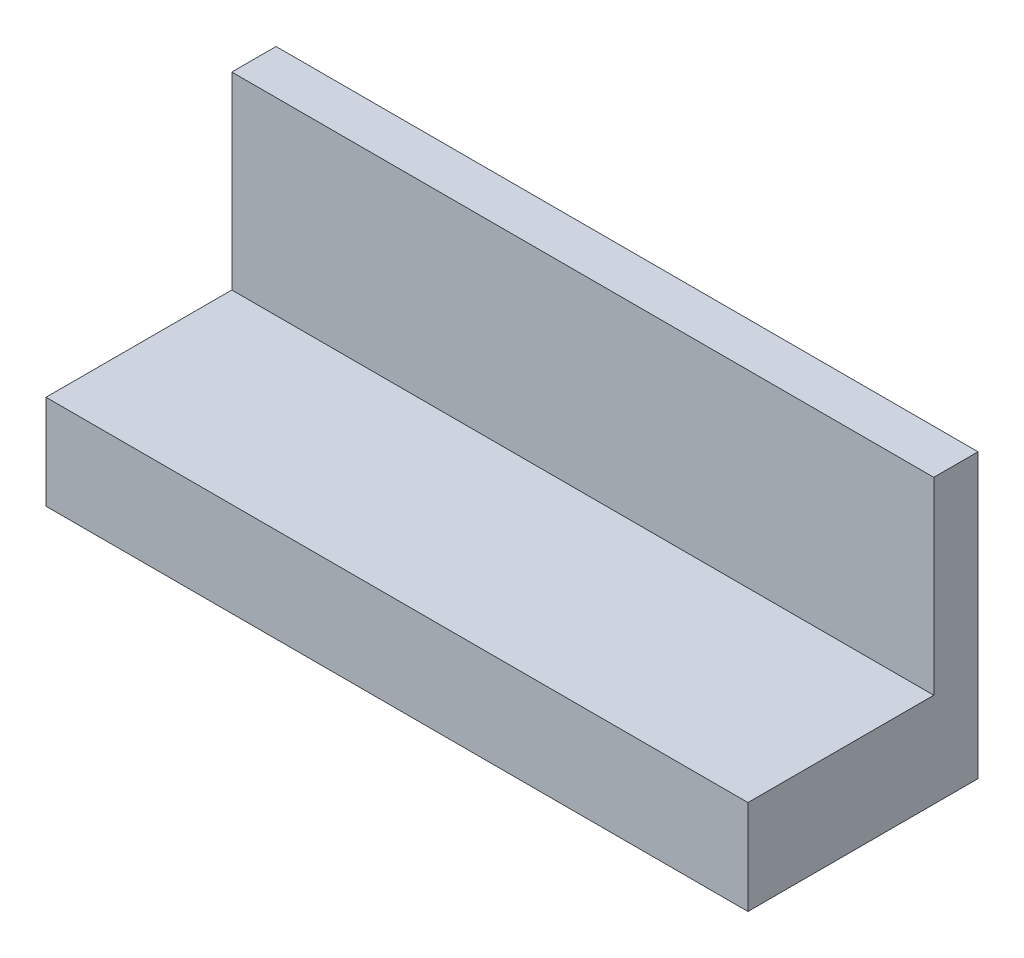
ISO-10303-21;
HEADER;
FILE_DESCRIPTION(('STEP AP214'),'2;1');
FILE_NAME('part.step','',(''),(''),'','','');
FILE_SCHEMA(('AUTOMOTIVE_DESIGN { 1 0 10303 214 1 1 1 1 }'));
ENDSEC;
DATA;
#1=APPLICATION_CONTEXT('core data for automotive mechanical design processes');
#2=APPLICATION_PROTOCOL_DEFINITION('international standard','automotive_design',2000,#1);
#3=PRODUCT_CONTEXT('',#1,'mechanical');
#4=PRODUCT('Part','Part','',(#3));
#5=PRODUCT_RELATED_PRODUCT_CATEGORY('part','',(#4));
#6=PRODUCT_DEFINITION_FORMATION('','',#4);
#7=PRODUCT_DEFINITION_CONTEXT('part definition',#1,'design');
#8=PRODUCT_DEFINITION('design','',#6,#7);
#9=PRODUCT_DEFINITION_SHAPE('','',#8);
#10=(LENGTH_UNIT() NAMED_UNIT(*) SI_UNIT(.MILLI.,.METRE.));
#11=(NAMED_UNIT(*) PLANE_ANGLE_UNIT() SI_UNIT($,.RADIAN.));
#12=(NAMED_UNIT(*) SI_UNIT($,.STERADIAN.) SOLID_ANGLE_UNIT());
#13=UNCERTAINTY_MEASURE_WITH_UNIT(LENGTH_MEASURE(1.E-05),#10,'distance_accuracy_value','');
#14=(GEOMETRIC_REPRESENTATION_CONTEXT(3) GLOBAL_UNCERTAINTY_ASSIGNED_CONTEXT((#13)) GLOBAL_UNIT_ASSIGNED_CONTEXT((#10,
#11,#12)) REPRESENTATION_CONTEXT('',''));
#15=CARTESIAN_POINT('',(0.,0.,0.));
#16=DIRECTION('',(0.,0.,1.));
#17=DIRECTION('',(1.,0.,0.));
#18=AXIS2_PLACEMENT_3D('',#15,#16,#17);
#19=CARTESIAN_POINT('',(0.,3.2,-7.8));
#20=DIRECTION('',(0.,1.,0.));
#21=DIRECTION('',(0.,0.,1.));
#22=AXIS2_PLACEMENT_3D('',#19,#20,#21);
#23=PLANE('',#22);
#24=DIRECTION('',(0.,0.,1.));
#25=VECTOR('',#24,1.);
#26=CARTESIAN_POINT('',(23.8,3.2,-7.8));
#27=LINE('',#26,#25);
#28=CARTESIAN_POINT('',(23.8,3.2,-6.3));
#29=VERTEX_POINT('',#28);
#30=CARTESIAN_POINT('',(23.8,3.2,0.));
#31=VERTEX_POINT('',#30);
#32=EDGE_CURVE('E58',#29,#31,#27,.T.);
#33=ORIENTED_EDGE('',*,*,#32,.F.);
#34=DIRECTION('',(-1.,0.,0.));
#35=VECTOR('',#34,1.);
#36=CARTESIAN_POINT('',(0.,3.2,-6.3));
#37=LINE('',#36,#35);
#38=CARTESIAN_POINT('',(0.,3.2,-6.3));
#39=VERTEX_POINT('',#38);
#40=EDGE_CURVE('E53',#29,#39,#37,.T.);
#41=ORIENTED_EDGE('',*,*,#40,.T.);
#42=DIRECTION('',(0.,0.,1.));
#43=VECTOR('',#42,1.);
#44=CARTESIAN_POINT('',(0.,3.2,-7.8));
#45=LINE('',#44,#43);
#46=CARTESIAN_POINT('',(0.,3.2,0.));
#47=VERTEX_POINT('',#46);
#48=EDGE_CURVE('E119',#39,#47,#45,.T.);
#49=ORIENTED_EDGE('',*,*,#48,.T.);
#50=DIRECTION('',(-1.,0.,0.));
#51=VECTOR('',#50,1.);
#52=CARTESIAN_POINT('',(0.,3.2,0.));
#53=LINE('',#52,#51);
#54=EDGE_CURVE('E191',#31,#47,#53,.T.);
#55=ORIENTED_EDGE('',*,*,#54,.F.);
#56=EDGE_LOOP('',(#33,#41,#49,#55));
#57=FACE_BOUND('',#56,.T.);
#58=ADVANCED_FACE('F38',(#57),#23,.T.);
#59=CARTESIAN_POINT('',(1.2,0.,-7.8));
#60=DIRECTION('',(-1.,0.,0.));
#61=DIRECTION('',(0.,0.,1.));
#62=AXIS2_PLACEMENT_3D('',#59,#60,#61);
#63=PLANE('',#62);
#64=DIRECTION('',(0.,-1.,0.));
#65=VECTOR('',#64,1.);
#66=CARTESIAN_POINT('',(1.2,0.,-6.3));
#67=LINE('',#66,#65);
#68=CARTESIAN_POINT('',(1.2,2.,-6.3));
#69=VERTEX_POINT('',#68);
#70=CARTESIAN_POINT('',(1.2,0.,-6.3));
#71=VERTEX_POINT('',#70);
#72=EDGE_CURVE('E145',#69,#71,#67,.T.);
#73=ORIENTED_EDGE('',*,*,#72,.F.);
#74=DIRECTION('',(0.,0.,1.));
#75=VECTOR('',#74,1.);
#76=CARTESIAN_POINT('',(1.2,2.,-7.8));
#77=LINE('',#76,#75);
#78=CARTESIAN_POINT('',(1.2,2.,-1.2));
#79=VERTEX_POINT('',#78);
#80=EDGE_CURVE('E171',#69,#79,#77,.T.);
#81=ORIENTED_EDGE('',*,*,#80,.T.);
#82=DIRECTION('',(0.,-1.,0.));
#83=VECTOR('',#82,1.);
#84=CARTESIAN_POINT('',(1.2,0.,-1.2));
#85=LINE('',#84,#83);
#86=CARTESIAN_POINT('',(1.2,0.,-1.2));
#87=VERTEX_POINT('',#86);
#88=EDGE_CURVE('E162',#79,#87,#85,.T.);
#89=ORIENTED_EDGE('',*,*,#88,.T.);
#90=DIRECTION('',(0.,0.,1.));
#91=VECTOR('',#90,1.);
#92=CARTESIAN_POINT('',(1.2,0.,-7.8));
#93=LINE('',#92,#91);
#94=EDGE_CURVE('E178',#71,#87,#93,.T.);
#95=ORIENTED_EDGE('',*,*,#94,.F.);
#96=EDGE_LOOP('',(#73,#81,#89,#95));
#97=FACE_BOUND('',#96,.T.);
#98=ADVANCED_FACE('F224',(#97),#63,.F.);
#99=CARTESIAN_POINT('',(0.,2.,-7.8));
#100=DIRECTION('',(0.,1.,0.));
#101=DIRECTION('',(0.,0.,1.));
#102=AXIS2_PLACEMENT_3D('',#99,#100,#101);
#103=PLANE('',#102);
#104=CARTESIAN_POINT('',(15.9,2.,-3.9));
#105=DIRECTION('',(0.,1.,0.));
#106=DIRECTION('',(0.,0.,1.));
#107=AXIS2_PLACEMENT_3D('',#104,#105,#106);
#108=CIRCLE('',#107,1.5);
#109=CARTESIAN_POINT('',(15.9,2.,-2.4));
#110=VERTEX_POINT('',#109);
#111=EDGE_CURVE('E208',#110,#110,#108,.F.);
#112=ORIENTED_EDGE('',*,*,#111,.F.);
#113=EDGE_LOOP('',(#112));
#114=FACE_BOUND('',#113,.T.);
#115=CARTESIAN_POINT('',(7.9,2.,-3.9));
#116=DIRECTION('',(0.,1.,0.));
#117=DIRECTION('',(0.,0.,1.));
#118=AXIS2_PLACEMENT_3D('',#115,#116,#117);
#119=CIRCLE('',#118,1.5);
#120=CARTESIAN_POINT('',(7.9,2.,-2.4));
#121=VERTEX_POINT('',#120);
#122=EDGE_CURVE('E46',#121,#121,#119,.F.);
#123=ORIENTED_EDGE('',*,*,#122,.F.);
#124=EDGE_LOOP('',(#123));
#125=FACE_BOUND('',#124,.T.);
#126=DIRECTION('',(-1.,0.,0.));
#127=VECTOR('',#126,1.);
#128=CARTESIAN_POINT('',(0.,2.,-6.3));
#129=LINE('',#128,#127);
#130=CARTESIAN_POINT('',(22.6,2.,-6.3));
#131=VERTEX_POINT('',#130);
#132=EDGE_CURVE('E141',#131,#69,#129,.T.);
#133=ORIENTED_EDGE('',*,*,#132,.F.);
#134=DIRECTION('',(0.,0.,1.));
#135=VECTOR('',#134,1.);
#136=CARTESIAN_POINT('',(22.6,2.,-7.8));
#137=LINE('',#136,#135);
#138=CARTESIAN_POINT('',(22.6,2.,-1.2));
#139=VERTEX_POINT('',#138);
#140=EDGE_CURVE('E174',#131,#139,#137,.T.);
#141=ORIENTED_EDGE('',*,*,#140,.T.);
#142=DIRECTION('',(-1.,0.,0.));
#143=VECTOR('',#142,1.);
#144=CARTESIAN_POINT('',(0.,2.,-1.2));
#145=LINE('',#144,#143);
#146=EDGE_CURVE('E175',#139,#79,#145,.T.);
#147=ORIENTED_EDGE('',*,*,#146,.T.);
#148=ORIENTED_EDGE('',*,*,#80,.F.);
#149=EDGE_LOOP('',(#133,#141,#147,#148));
#150=FACE_BOUND('',#149,.T.);
#151=ADVANCED_FACE('F220',(#114,#125,#150),#103,.F.);
#152=CARTESIAN_POINT('',(22.6,0.,-7.8));
#153=DIRECTION('',(1.,0.,0.));
#154=DIRECTION('',(0.,0.,-1.));
#155=AXIS2_PLACEMENT_3D('',#152,#153,#154);
#156=PLANE('',#155);
#157=DIRECTION('',(0.,1.,0.));
#158=VECTOR('',#157,1.);
#159=CARTESIAN_POINT('',(22.6,0.,-6.3));
#160=LINE('',#159,#158);
#161=CARTESIAN_POINT('',(22.6,0.,-6.3));
#162=VERTEX_POINT('',#161);
#163=EDGE_CURVE('E12',#162,#131,#160,.T.);
#164=ORIENTED_EDGE('',*,*,#163,.F.);
#165=DIRECTION('',(0.,0.,1.));
#166=VECTOR('',#165,1.);
#167=CARTESIAN_POINT('',(22.6,0.,-7.8));
#168=LINE('',#167,#166);
#169=CARTESIAN_POINT('',(22.6,0.,-1.2));
#170=VERTEX_POINT('',#169);
#171=EDGE_CURVE('E181',#162,#170,#168,.T.);
#172=ORIENTED_EDGE('',*,*,#171,.T.);
#173=DIRECTION('',(0.,1.,0.));
#174=VECTOR('',#173,1.);
#175=CARTESIAN_POINT('',(22.6,0.,-1.2));
#176=LINE('',#175,#174);
#177=EDGE_CURVE('E179',#170,#139,#176,.T.);
#178=ORIENTED_EDGE('',*,*,#177,.T.);
#179=ORIENTED_EDGE('',*,*,#140,.F.);
#180=EDGE_LOOP('',(#164,#172,#178,#179));
#181=FACE_BOUND('',#180,.T.);
#182=ADVANCED_FACE('F223',(#181),#156,.F.);
#183=CARTESIAN_POINT('',(0.,0.,-7.8));
#184=DIRECTION('',(0.,-1.,0.));
#185=DIRECTION('',(0.,0.,-1.));
#186=AXIS2_PLACEMENT_3D('',#183,#184,#185);
#187=PLANE('',#186);
#188=DIRECTION('',(-1.,0.,0.));
#189=VECTOR('',#188,1.);
#190=CARTESIAN_POINT('',(23.8,0.,-6.3));
#191=LINE('',#190,#189);
#192=EDGE_CURVE('E123',#162,#71,#191,.T.);
#193=ORIENTED_EDGE('',*,*,#192,.T.);
#194=ORIENTED_EDGE('',*,*,#94,.T.);
#195=DIRECTION('',(1.,0.,0.));
#196=VECTOR('',#195,1.);
#197=CARTESIAN_POINT('',(0.,0.,-1.2));
#198=LINE('',#197,#196);
#199=EDGE_CURVE('E170',#87,#170,#198,.T.);
#200=ORIENTED_EDGE('',*,*,#199,.T.);
#201=ORIENTED_EDGE('',*,*,#171,.F.);
#202=EDGE_LOOP('',(#193,#194,#200,#201));
#203=FACE_BOUND('',#202,.T.);
#204=DIRECTION('',(1.,0.,0.));
#205=VECTOR('',#204,1.);
#206=CARTESIAN_POINT('',(0.,0.,0.));
#207=LINE('',#206,#205);
#208=CARTESIAN_POINT('',(0.,0.,0.));
#209=VERTEX_POINT('',#208);
#210=CARTESIAN_POINT('',(23.8,0.,0.));
#211=VERTEX_POINT('',#210);
#212=EDGE_CURVE('E199',#209,#211,#207,.T.);
#213=ORIENTED_EDGE('',*,*,#212,.F.);
#214=DIRECTION('',(0.,0.,1.));
#215=VECTOR('',#214,1.);
#216=CARTESIAN_POINT('',(0.,0.,-7.8));
#217=LINE('',#216,#215);
#218=CARTESIAN_POINT('',(0.,0.,-7.8));
#219=VERTEX_POINT('',#218);
#220=EDGE_CURVE('E196',#219,#209,#217,.T.);
#221=ORIENTED_EDGE('',*,*,#220,.F.);
#222=DIRECTION('',(1.,0.,0.));
#223=VECTOR('',#222,1.);
#224=CARTESIAN_POINT('',(0.,0.,-7.8));
#225=LINE('',#224,#223);
#226=CARTESIAN_POINT('',(23.8,0.,-7.8));
#227=VERTEX_POINT('',#226);
#228=EDGE_CURVE('E190',#219,#227,#225,.T.);
#229=ORIENTED_EDGE('',*,*,#228,.T.);
#230=DIRECTION('',(0.,0.,1.));
#231=VECTOR('',#230,1.);
#232=CARTESIAN_POINT('',(23.8,0.,-7.8));
#233=LINE('',#232,#231);
#234=EDGE_CURVE('E210',#227,#211,#233,.T.);
#235=ORIENTED_EDGE('',*,*,#234,.T.);
#236=EDGE_LOOP('',(#213,#221,#229,#235));
#237=FACE_BOUND('',#236,.T.);
#238=ADVANCED_FACE('F250',(#203,#237),#187,.T.);
#239=CARTESIAN_POINT('',(0.,0.,-7.8));
#240=DIRECTION('',(-1.,0.,0.));
#241=DIRECTION('',(0.,0.,1.));
#242=AXIS2_PLACEMENT_3D('',#239,#240,#241);
#243=PLANE('',#242);
#244=ORIENTED_EDGE('',*,*,#220,.T.);
#245=DIRECTION('',(0.,-1.,0.));
#246=VECTOR('',#245,1.);
#247=CARTESIAN_POINT('',(0.,0.,0.));
#248=LINE('',#247,#246);
#249=EDGE_CURVE('E173',#47,#209,#248,.T.);
#250=ORIENTED_EDGE('',*,*,#249,.F.);
#251=ORIENTED_EDGE('',*,*,#48,.F.);
#252=DIRECTION('',(0.,1.,0.));
#253=VECTOR('',#252,1.);
#254=CARTESIAN_POINT('',(0.,0.,-6.3));
#255=LINE('',#254,#253);
#256=CARTESIAN_POINT('',(0.,9.6,-6.3));
#257=VERTEX_POINT('',#256);
#258=EDGE_CURVE('E113',#39,#257,#255,.T.);
#259=ORIENTED_EDGE('',*,*,#258,.T.);
#260=DIRECTION('',(0.,0.,-1.));
#261=VECTOR('',#260,1.);
#262=CARTESIAN_POINT('',(0.,9.6,-6.3));
#263=LINE('',#262,#261);
#264=CARTESIAN_POINT('',(0.,9.6,-7.8));
#265=VERTEX_POINT('',#264);
#266=EDGE_CURVE('E116',#257,#265,#263,.T.);
#267=ORIENTED_EDGE('',*,*,#266,.T.);
#268=DIRECTION('',(0.,-1.,0.));
#269=VECTOR('',#268,1.);
#270=CARTESIAN_POINT('',(0.,0.,-7.8));
#271=LINE('',#270,#269);
#272=EDGE_CURVE('E188',#265,#219,#271,.T.);
#273=ORIENTED_EDGE('',*,*,#272,.T.);
#274=EDGE_LOOP('',(#244,#250,#251,#259,#267,#273));
#275=FACE_BOUND('',#274,.T.);
#276=ADVANCED_FACE('F40',(#275),#243,.T.);
#277=CARTESIAN_POINT('',(23.8,0.,-7.8));
#278=DIRECTION('',(1.,0.,0.));
#279=DIRECTION('',(0.,0.,-1.));
#280=AXIS2_PLACEMENT_3D('',#277,#278,#279);
#281=PLANE('',#280);
#282=DIRECTION('',(0.,1.,0.));
#283=VECTOR('',#282,1.);
#284=CARTESIAN_POINT('',(23.8,0.,-7.8));
#285=LINE('',#284,#283);
#286=CARTESIAN_POINT('',(23.8,9.6,-7.8));
#287=VERTEX_POINT('',#286);
#288=EDGE_CURVE('E194',#227,#287,#285,.T.);
#289=ORIENTED_EDGE('',*,*,#288,.T.);
#290=DIRECTION('',(0.,0.,-1.));
#291=VECTOR('',#290,1.);
#292=CARTESIAN_POINT('',(23.8,9.6,-6.3));
#293=LINE('',#292,#291);
#294=CARTESIAN_POINT('',(23.8,9.6,-6.3));
#295=VERTEX_POINT('',#294);
#296=EDGE_CURVE('E131',#295,#287,#293,.T.);
#297=ORIENTED_EDGE('',*,*,#296,.F.);
#298=DIRECTION('',(0.,-1.,0.));
#299=VECTOR('',#298,1.);
#300=CARTESIAN_POINT('',(23.8,3.2,-6.3));
#301=LINE('',#300,#299);
#302=EDGE_CURVE('E135',#295,#29,#301,.T.);
#303=ORIENTED_EDGE('',*,*,#302,.T.);
#304=ORIENTED_EDGE('',*,*,#32,.T.);
#305=DIRECTION('',(0.,1.,0.));
#306=VECTOR('',#305,1.);
#307=CARTESIAN_POINT('',(23.8,0.,0.));
#308=LINE('',#307,#306);
#309=EDGE_CURVE('E202',#211,#31,#308,.T.);
#310=ORIENTED_EDGE('',*,*,#309,.F.);
#311=ORIENTED_EDGE('',*,*,#234,.F.);
#312=EDGE_LOOP('',(#289,#297,#303,#304,#310,#311));
#313=FACE_BOUND('',#312,.T.);
#314=ADVANCED_FACE('F242',(#313),#281,.T.);
#315=CARTESIAN_POINT('',(0.,0.,-7.8));
#316=DIRECTION('',(0.,0.,-1.));
#317=DIRECTION('',(-1.,0.,0.));
#318=AXIS2_PLACEMENT_3D('',#315,#316,#317);
#319=PLANE('',#318);
#320=ORIENTED_EDGE('',*,*,#272,.F.);
#321=DIRECTION('',(1.,0.,0.));
#322=VECTOR('',#321,1.);
#323=CARTESIAN_POINT('',(0.,9.6,-7.8));
#324=LINE('',#323,#322);
#325=EDGE_CURVE('E130',#265,#287,#324,.T.);
#326=ORIENTED_EDGE('',*,*,#325,.T.);
#327=ORIENTED_EDGE('',*,*,#288,.F.);
#328=ORIENTED_EDGE('',*,*,#228,.F.);
#329=EDGE_LOOP('',(#320,#326,#327,#328));
#330=FACE_BOUND('',#329,.T.);
#331=ADVANCED_FACE('F246',(#330),#319,.T.);
#332=CARTESIAN_POINT('',(0.,0.,0.));
#333=DIRECTION('',(0.,0.,-1.));
#334=DIRECTION('',(-1.,0.,0.));
#335=AXIS2_PLACEMENT_3D('',#332,#333,#334);
#336=PLANE('',#335);
#337=ORIENTED_EDGE('',*,*,#249,.T.);
#338=ORIENTED_EDGE('',*,*,#212,.T.);
#339=ORIENTED_EDGE('',*,*,#309,.T.);
#340=ORIENTED_EDGE('',*,*,#54,.T.);
#341=EDGE_LOOP('',(#337,#338,#339,#340));
#342=FACE_BOUND('',#341,.T.);
#343=ADVANCED_FACE('F252',(#342),#336,.F.);
#344=CARTESIAN_POINT('',(0.,0.,-1.2));
#345=DIRECTION('',(0.,0.,-1.));
#346=DIRECTION('',(-1.,0.,0.));
#347=AXIS2_PLACEMENT_3D('',#344,#345,#346);
#348=PLANE('',#347);
#349=ORIENTED_EDGE('',*,*,#88,.F.);
#350=ORIENTED_EDGE('',*,*,#146,.F.);
#351=ORIENTED_EDGE('',*,*,#177,.F.);
#352=ORIENTED_EDGE('',*,*,#199,.F.);
#353=EDGE_LOOP('',(#349,#350,#351,#352));
#354=FACE_BOUND('',#353,.T.);
#355=ADVANCED_FACE('F273',(#354),#348,.T.);
#356=CARTESIAN_POINT('',(15.9,-4.24264068711929,-3.9));
#357=DIRECTION('',(0.,1.,0.));
#358=DIRECTION('',(0.,0.,1.));
#359=AXIS2_PLACEMENT_3D('',#356,#357,#358);
#360=CYLINDRICAL_SURFACE('',#359,1.5);
#361=ORIENTED_EDGE('',*,*,#111,.T.);
#362=EDGE_LOOP('',(#361));
#363=FACE_BOUND('',#362,.T.);
#364=CARTESIAN_POINT('',(15.9,0.2,-3.9));
#365=DIRECTION('',(0.,-1.,0.));
#366=DIRECTION('',(0.,0.,-1.));
#367=AXIS2_PLACEMENT_3D('',#364,#365,#366);
#368=CIRCLE('',#367,1.5);
#369=CARTESIAN_POINT('',(15.9,0.2,-5.4));
#370=VERTEX_POINT('',#369);
#371=EDGE_CURVE('E159',#370,#370,#368,.T.);
#372=ORIENTED_EDGE('',*,*,#371,.F.);
#373=EDGE_LOOP('',(#372));
#374=FACE_BOUND('',#373,.T.);
#375=ADVANCED_FACE('F275',(#363,#374),#360,.T.);
#376=CARTESIAN_POINT('',(15.9,-4.24264068711929,-3.9));
#377=DIRECTION('',(0.,1.,0.));
#378=DIRECTION('',(0.,0.,1.));
#379=AXIS2_PLACEMENT_3D('',#376,#377,#378);
#380=CYLINDRICAL_SURFACE('',#379,0.6);
#381=CARTESIAN_POINT('',(15.9,2.,-3.9));
#382=DIRECTION('',(0.,-1.,0.));
#383=DIRECTION('',(0.,0.,-1.));
#384=AXIS2_PLACEMENT_3D('',#381,#382,#383);
#385=CIRCLE('',#384,0.6);
#386=CARTESIAN_POINT('',(15.9,2.,-4.5));
#387=VERTEX_POINT('',#386);
#388=EDGE_CURVE('E163',#387,#387,#385,.T.);
#389=ORIENTED_EDGE('',*,*,#388,.F.);
#390=EDGE_LOOP('',(#389));
#391=FACE_BOUND('',#390,.T.);
#392=CARTESIAN_POINT('',(15.9,0.2,-3.9));
#393=DIRECTION('',(0.,-1.,0.));
#394=DIRECTION('',(0.,0.,-1.));
#395=AXIS2_PLACEMENT_3D('',#392,#393,#394);
#396=CIRCLE('',#395,0.6);
#397=CARTESIAN_POINT('',(15.9,0.2,-4.5));
#398=VERTEX_POINT('',#397);
#399=EDGE_CURVE('E153',#398,#398,#396,.T.);
#400=ORIENTED_EDGE('',*,*,#399,.T.);
#401=EDGE_LOOP('',(#400));
#402=FACE_BOUND('',#401,.T.);
#403=ADVANCED_FACE('F293',(#391,#402),#380,.F.);
#404=CARTESIAN_POINT('',(0.,0.2,-7.8));
#405=DIRECTION('',(0.,-1.,0.));
#406=DIRECTION('',(0.,0.,-1.));
#407=AXIS2_PLACEMENT_3D('',#404,#405,#406);
#408=PLANE('',#407);
#409=ORIENTED_EDGE('',*,*,#399,.F.);
#410=EDGE_LOOP('',(#409));
#411=FACE_BOUND('',#410,.T.);
#412=ORIENTED_EDGE('',*,*,#371,.T.);
#413=EDGE_LOOP('',(#412));
#414=FACE_BOUND('',#413,.T.);
#415=ADVANCED_FACE('F301',(#411,#414),#408,.T.);
#416=ORIENTED_EDGE('',*,*,#388,.T.);
#417=EDGE_LOOP('',(#416));
#418=FACE_BOUND('',#417,.T.);
#419=ADVANCED_FACE('F228',(#418),#103,.F.);
#420=CARTESIAN_POINT('',(7.9,-4.24264068711929,-3.9));
#421=DIRECTION('',(0.,1.,0.));
#422=DIRECTION('',(0.,0.,1.));
#423=AXIS2_PLACEMENT_3D('',#420,#421,#422);
#424=CYLINDRICAL_SURFACE('',#423,1.5);
#425=ORIENTED_EDGE('',*,*,#122,.T.);
#426=EDGE_LOOP('',(#425));
#427=FACE_BOUND('',#426,.T.);
#428=CARTESIAN_POINT('',(7.9,0.2,-3.9));
#429=DIRECTION('',(0.,-1.,0.));
#430=DIRECTION('',(0.,0.,-1.));
#431=AXIS2_PLACEMENT_3D('',#428,#429,#430);
#432=CIRCLE('',#431,1.5);
#433=CARTESIAN_POINT('',(7.9,0.2,-5.4));
#434=VERTEX_POINT('',#433);
#435=EDGE_CURVE('E150',#434,#434,#432,.T.);
#436=ORIENTED_EDGE('',*,*,#435,.F.);
#437=EDGE_LOOP('',(#436));
#438=FACE_BOUND('',#437,.T.);
#439=ADVANCED_FACE('F217',(#427,#438),#424,.T.);
#440=CARTESIAN_POINT('',(7.9,-4.24264068711929,-3.9));
#441=DIRECTION('',(0.,1.,0.));
#442=DIRECTION('',(0.,0.,1.));
#443=AXIS2_PLACEMENT_3D('',#440,#441,#442);
#444=CYLINDRICAL_SURFACE('',#443,0.6);
#445=CARTESIAN_POINT('',(7.9,2.,-3.9));
#446=DIRECTION('',(0.,-1.,0.));
#447=DIRECTION('',(0.,0.,-1.));
#448=AXIS2_PLACEMENT_3D('',#445,#446,#447);
#449=CIRCLE('',#448,0.6);
#450=CARTESIAN_POINT('',(7.9,2.,-4.5));
#451=VERTEX_POINT('',#450);
#452=EDGE_CURVE('E154',#451,#451,#449,.T.);
#453=ORIENTED_EDGE('',*,*,#452,.F.);
#454=EDGE_LOOP('',(#453));
#455=FACE_BOUND('',#454,.T.);
#456=CARTESIAN_POINT('',(7.9,0.2,-3.9));
#457=DIRECTION('',(0.,-1.,0.));
#458=DIRECTION('',(0.,0.,-1.));
#459=AXIS2_PLACEMENT_3D('',#456,#457,#458);
#460=CIRCLE('',#459,0.6);
#461=CARTESIAN_POINT('',(7.9,0.2,-4.5));
#462=VERTEX_POINT('',#461);
#463=EDGE_CURVE('E149',#462,#462,#460,.T.);
#464=ORIENTED_EDGE('',*,*,#463,.T.);
#465=EDGE_LOOP('',(#464));
#466=FACE_BOUND('',#465,.T.);
#467=ADVANCED_FACE('F322',(#455,#466),#444,.F.);
#468=CARTESIAN_POINT('',(0.,0.2,-7.8));
#469=DIRECTION('',(0.,-1.,0.));
#470=DIRECTION('',(0.,0.,-1.));
#471=AXIS2_PLACEMENT_3D('',#468,#469,#470);
#472=PLANE('',#471);
#473=ORIENTED_EDGE('',*,*,#463,.F.);
#474=EDGE_LOOP('',(#473));
#475=FACE_BOUND('',#474,.T.);
#476=ORIENTED_EDGE('',*,*,#435,.T.);
#477=EDGE_LOOP('',(#476));
#478=FACE_BOUND('',#477,.T.);
#479=ADVANCED_FACE('F329',(#475,#478),#472,.T.);
#480=ORIENTED_EDGE('',*,*,#452,.T.);
#481=EDGE_LOOP('',(#480));
#482=FACE_BOUND('',#481,.T.);
#483=ADVANCED_FACE('F227',(#482),#103,.F.);
#484=CARTESIAN_POINT('',(0.,0.,-6.3));
#485=DIRECTION('',(0.,0.,-1.));
#486=DIRECTION('',(-1.,0.,0.));
#487=AXIS2_PLACEMENT_3D('',#484,#485,#486);
#488=PLANE('',#487);
#489=ORIENTED_EDGE('',*,*,#132,.T.);
#490=ORIENTED_EDGE('',*,*,#72,.T.);
#491=ORIENTED_EDGE('',*,*,#192,.F.);
#492=ORIENTED_EDGE('',*,*,#163,.T.);
#493=EDGE_LOOP('',(#489,#490,#491,#492));
#494=FACE_BOUND('',#493,.T.);
#495=ADVANCED_FACE('F237',(#494),#488,.F.);
#496=CARTESIAN_POINT('',(0.,9.6,-6.3));
#497=DIRECTION('',(0.,1.,0.));
#498=DIRECTION('',(-1.,0.,0.));
#499=AXIS2_PLACEMENT_3D('',#496,#497,#498);
#500=PLANE('',#499);
#501=ORIENTED_EDGE('',*,*,#325,.F.);
#502=ORIENTED_EDGE('',*,*,#266,.F.);
#503=DIRECTION('',(1.,0.,0.));
#504=VECTOR('',#503,1.);
#505=CARTESIAN_POINT('',(0.,9.6,-6.3));
#506=LINE('',#505,#504);
#507=EDGE_CURVE('E122',#257,#295,#506,.T.);
#508=ORIENTED_EDGE('',*,*,#507,.T.);
#509=ORIENTED_EDGE('',*,*,#296,.T.);
#510=EDGE_LOOP('',(#501,#502,#508,#509));
#511=FACE_BOUND('',#510,.T.);
#512=ADVANCED_FACE('F127',(#511),#500,.T.);
#513=ORIENTED_EDGE('',*,*,#40,.F.);
#514=ORIENTED_EDGE('',*,*,#302,.F.);
#515=ORIENTED_EDGE('',*,*,#507,.F.);
#516=ORIENTED_EDGE('',*,*,#258,.F.);
#517=EDGE_LOOP('',(#513,#514,#515,#516));
#518=FACE_BOUND('',#517,.T.);
#519=ADVANCED_FACE('F133',(#518),#488,.F.);
#520=CLOSED_SHELL('',(#58,#98,#151,#182,#238,#276,#314,#331,#343,#355,#375,#403,#415,#419,#439,
#467,#479,#483,#495,#512,#519));
#521=MANIFOLD_SOLID_BREP('B2',#520);
#522=ADVANCED_BREP_SHAPE_REPRESENTATION('',(#18,#521),#14);
#523=SHAPE_DEFINITION_REPRESENTATION(#9,#522);
ENDSEC;
END-ISO-10303-21;
